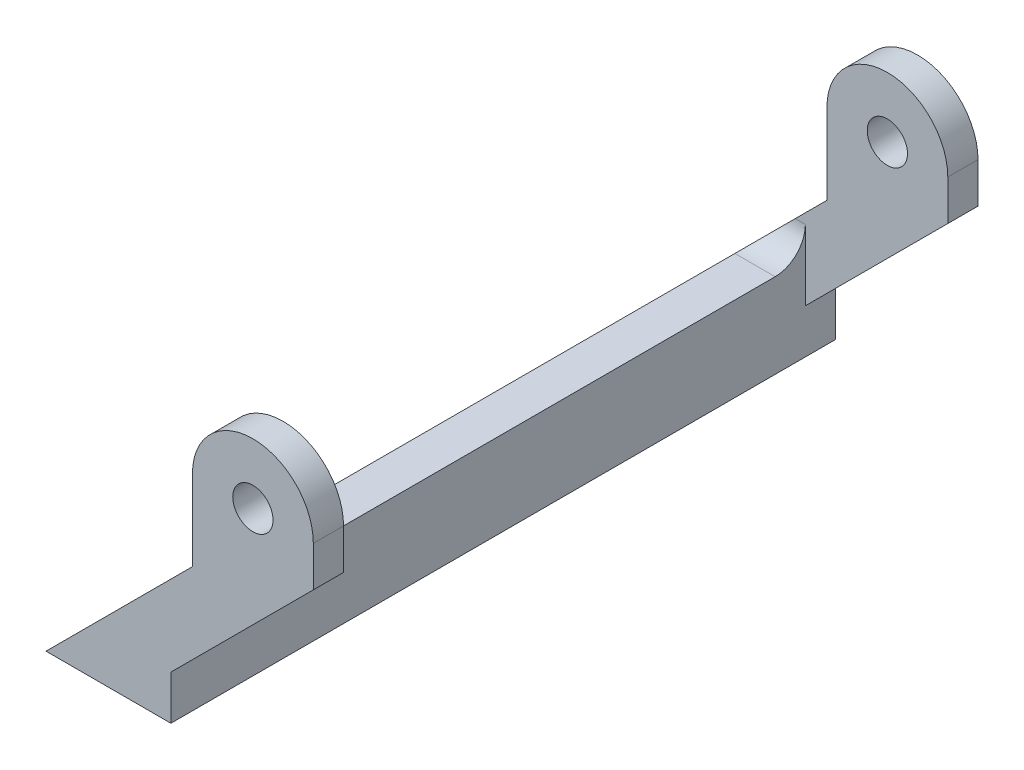
ISO-10303-21;
HEADER;
FILE_DESCRIPTION(('STEP AP214'),'2;1');
FILE_NAME('part.step','',(''),(''),'','','');
FILE_SCHEMA(('AUTOMOTIVE_DESIGN { 1 0 10303 214 1 1 1 1 }'));
ENDSEC;
DATA;
#1=APPLICATION_CONTEXT('core data for automotive mechanical design processes');
#2=APPLICATION_PROTOCOL_DEFINITION('international standard','automotive_design',2000,#1);
#3=PRODUCT_CONTEXT('',#1,'mechanical');
#4=PRODUCT('Part','Part','',(#3));
#5=PRODUCT_RELATED_PRODUCT_CATEGORY('part','',(#4));
#6=PRODUCT_DEFINITION_FORMATION('','',#4);
#7=PRODUCT_DEFINITION_CONTEXT('part definition',#1,'design');
#8=PRODUCT_DEFINITION('design','',#6,#7);
#9=PRODUCT_DEFINITION_SHAPE('','',#8);
#10=(LENGTH_UNIT() NAMED_UNIT(*) SI_UNIT(.MILLI.,.METRE.));
#11=(NAMED_UNIT(*) PLANE_ANGLE_UNIT() SI_UNIT($,.RADIAN.));
#12=(NAMED_UNIT(*) SI_UNIT($,.STERADIAN.) SOLID_ANGLE_UNIT());
#13=UNCERTAINTY_MEASURE_WITH_UNIT(LENGTH_MEASURE(1.E-05),#10,'distance_accuracy_value','');
#14=(GEOMETRIC_REPRESENTATION_CONTEXT(3) GLOBAL_UNCERTAINTY_ASSIGNED_CONTEXT((#13)) GLOBAL_UNIT_ASSIGNED_CONTEXT((#10,
#11,#12)) REPRESENTATION_CONTEXT('',''));
#15=CARTESIAN_POINT('',(0.,0.,0.));
#16=DIRECTION('',(0.,0.,1.));
#17=DIRECTION('',(1.,0.,0.));
#18=AXIS2_PLACEMENT_3D('',#15,#16,#17);
#19=CARTESIAN_POINT('',(3.33673374268399,8.94083562968921,3.));
#20=DIRECTION('',(0.,0.,-1.));
#21=DIRECTION('',(-1.,0.,0.));
#22=AXIS2_PLACEMENT_3D('',#19,#20,#21);
#23=CYLINDRICAL_SURFACE('',#22,6.00000000000001);
#24=CARTESIAN_POINT('',(3.33673374268399,8.94083562968921,0.));
#25=DIRECTION('',(0.,0.,1.));
#26=DIRECTION('',(-1.,0.,0.));
#27=AXIS2_PLACEMENT_3D('',#24,#25,#26);
#28=CIRCLE('',#27,6.00000000000001);
#29=CARTESIAN_POINT('',(9.33673374268399,8.94083562968921,0.));
#30=VERTEX_POINT('',#29);
#31=CARTESIAN_POINT('',(-2.66326625731602,8.94083562968921,0.));
#32=VERTEX_POINT('',#31);
#33=EDGE_CURVE('E218',#30,#32,#28,.T.);
#34=ORIENTED_EDGE('',*,*,#33,.T.);
#35=DIRECTION('',(0.,0.,-1.));
#36=VECTOR('',#35,1.);
#37=CARTESIAN_POINT('',(-2.66326625731602,8.94083562968921,3.));
#38=LINE('',#37,#36);
#39=CARTESIAN_POINT('',(-2.66326625731602,8.94083562968921,3.));
#40=VERTEX_POINT('',#39);
#41=EDGE_CURVE('E254',#40,#32,#38,.T.);
#42=ORIENTED_EDGE('',*,*,#41,.F.);
#43=CARTESIAN_POINT('',(3.33673374268399,8.94083562968921,3.));
#44=DIRECTION('',(0.,0.,1.));
#45=DIRECTION('',(-1.,0.,0.));
#46=AXIS2_PLACEMENT_3D('',#43,#44,#45);
#47=CIRCLE('',#46,6.00000000000001);
#48=CARTESIAN_POINT('',(9.33673374268399,8.94083562968921,3.));
#49=VERTEX_POINT('',#48);
#50=EDGE_CURVE('E219',#49,#40,#47,.T.);
#51=ORIENTED_EDGE('',*,*,#50,.F.);
#52=DIRECTION('',(0.,0.,-1.));
#53=VECTOR('',#52,1.);
#54=CARTESIAN_POINT('',(9.33673374268399,8.94083562968921,3.));
#55=LINE('',#54,#53);
#56=EDGE_CURVE('E234',#49,#30,#55,.T.);
#57=ORIENTED_EDGE('',*,*,#56,.T.);
#58=EDGE_LOOP('',(#34,#42,#51,#57));
#59=FACE_BOUND('',#58,.T.);
#60=ADVANCED_FACE('F32',(#59),#23,.T.);
#61=CARTESIAN_POINT('',(-2.663266257316,0.940835629689225,3.));
#62=DIRECTION('',(1.,0.,0.));
#63=DIRECTION('',(0.,1.,0.));
#64=AXIS2_PLACEMENT_3D('',#61,#62,#63);
#65=PLANE('',#64);
#66=DIRECTION('',(0.,-1.,0.));
#67=VECTOR('',#66,1.);
#68=CARTESIAN_POINT('',(-2.663266257316,0.940835629689225,0.));
#69=LINE('',#68,#67);
#70=CARTESIAN_POINT('',(-2.663266257316,0.940835629689225,0.));
#71=VERTEX_POINT('',#70);
#72=EDGE_CURVE('E237',#32,#71,#69,.T.);
#73=ORIENTED_EDGE('',*,*,#72,.T.);
#74=DIRECTION('',(0.,0.,-1.));
#75=VECTOR('',#74,1.);
#76=CARTESIAN_POINT('',(-2.663266257316,0.940835629689225,3.));
#77=LINE('',#76,#75);
#78=CARTESIAN_POINT('',(-2.663266257316,0.940835629689225,3.));
#79=VERTEX_POINT('',#78);
#80=EDGE_CURVE('E251',#79,#71,#77,.T.);
#81=ORIENTED_EDGE('',*,*,#80,.F.);
#82=DIRECTION('',(0.,-1.,0.));
#83=VECTOR('',#82,1.);
#84=CARTESIAN_POINT('',(-2.663266257316,0.940835629689225,3.));
#85=LINE('',#84,#83);
#86=EDGE_CURVE('E222',#40,#79,#85,.T.);
#87=ORIENTED_EDGE('',*,*,#86,.F.);
#88=ORIENTED_EDGE('',*,*,#41,.T.);
#89=EDGE_LOOP('',(#73,#81,#87,#88));
#90=FACE_BOUND('',#89,.T.);
#91=ADVANCED_FACE('F322',(#90),#65,.F.);
#92=CARTESIAN_POINT('',(-8.80540188104695,-5.2012999940417,3.));
#93=DIRECTION('',(0.707106781186546,-0.707106781186549,0.));
#94=DIRECTION('',(0.707106781186549,0.707106781186546,0.));
#95=AXIS2_PLACEMENT_3D('',#92,#93,#94);
#96=PLANE('',#95);
#97=DIRECTION('',(-0.707106781186549,-0.707106781186546,0.));
#98=VECTOR('',#97,1.);
#99=CARTESIAN_POINT('',(-8.80540188104695,-5.2012999940417,0.));
#100=LINE('',#99,#98);
#101=CARTESIAN_POINT('',(-17.205401881047,-13.6012999940417,0.));
#102=VERTEX_POINT('',#101);
#103=EDGE_CURVE('E239',#71,#102,#100,.T.);
#104=ORIENTED_EDGE('',*,*,#103,.T.);
#105=DIRECTION('',(0.,0.,-1.));
#106=VECTOR('',#105,1.);
#107=CARTESIAN_POINT('',(-17.205401881047,-13.6012999940417,66.));
#108=LINE('',#107,#106);
#109=CARTESIAN_POINT('',(-17.205401881047,-13.6012999940417,66.));
#110=VERTEX_POINT('',#109);
#111=EDGE_CURVE('E215',#110,#102,#108,.T.);
#112=ORIENTED_EDGE('',*,*,#111,.F.);
#113=DIRECTION('',(-0.707106781186551,-0.707106781186544,0.));
#114=VECTOR('',#113,1.);
#115=CARTESIAN_POINT('',(-17.205401881047,-13.6012999940417,66.));
#116=LINE('',#115,#114);
#117=CARTESIAN_POINT('',(-2.663266257316,0.940835629689225,66.));
#118=VERTEX_POINT('',#117);
#119=EDGE_CURVE('E195',#118,#110,#116,.T.);
#120=ORIENTED_EDGE('',*,*,#119,.F.);
#121=DIRECTION('',(0.,0.,1.));
#122=VECTOR('',#121,1.);
#123=CARTESIAN_POINT('',(-2.663266257316,0.940835629689225,63.));
#124=LINE('',#123,#122);
#125=CARTESIAN_POINT('',(-2.663266257316,0.940835629689225,63.));
#126=VERTEX_POINT('',#125);
#127=EDGE_CURVE('E186',#126,#118,#124,.T.);
#128=ORIENTED_EDGE('',*,*,#127,.F.);
#129=DIRECTION('',(-0.707106781186549,-0.707106781186546,0.));
#130=VECTOR('',#129,1.);
#131=CARTESIAN_POINT('',(-8.80540188104695,-5.2012999940417,63.));
#132=LINE('',#131,#130);
#133=CARTESIAN_POINT('',(-5.80540188104694,-2.2012999940417,63.));
#134=VERTEX_POINT('',#133);
#135=EDGE_CURVE('E164',#126,#134,#132,.T.);
#136=ORIENTED_EDGE('',*,*,#135,.T.);
#137=CARTESIAN_POINT('',(-5.80540188104694,-2.2012999940417,60.));
#138=DIRECTION('',(0.707106781186546,-0.707106781186549,0.));
#139=DIRECTION('',(0.707106781186549,0.707106781186546,0.));
#140=AXIS2_PLACEMENT_3D('',#137,#138,#139);
#141=ELLIPSE('',#140,4.24264068711929,3.);
#142=CARTESIAN_POINT('',(-8.80540188104695,-5.2012999940417,60.));
#143=VERTEX_POINT('',#142);
#144=EDGE_CURVE('E11',#134,#143,#141,.T.);
#145=ORIENTED_EDGE('',*,*,#144,.T.);
#146=DIRECTION('',(0.,0.,-1.));
#147=VECTOR('',#146,1.);
#148=CARTESIAN_POINT('',(-8.80540188104695,-5.2012999940417,66.));
#149=LINE('',#148,#147);
#150=CARTESIAN_POINT('',(-8.80540188104695,-5.2012999940417,6.));
#151=VERTEX_POINT('',#150);
#152=EDGE_CURVE('E203',#143,#151,#149,.T.);
#153=ORIENTED_EDGE('',*,*,#152,.T.);
#154=CARTESIAN_POINT('',(-5.80540188104694,-2.2012999940417,6.));
#155=DIRECTION('',(0.707106781186546,-0.707106781186549,0.));
#156=DIRECTION('',(-0.707106781186549,-0.707106781186546,0.));
#157=AXIS2_PLACEMENT_3D('',#154,#155,#156);
#158=ELLIPSE('',#157,4.24264068711929,3.);
#159=CARTESIAN_POINT('',(-5.80540188104694,-2.2012999940417,3.));
#160=VERTEX_POINT('',#159);
#161=EDGE_CURVE('E268',#151,#160,#158,.T.);
#162=ORIENTED_EDGE('',*,*,#161,.T.);
#163=DIRECTION('',(-0.707106781186549,-0.707106781186546,0.));
#164=VECTOR('',#163,1.);
#165=CARTESIAN_POINT('',(-8.80540188104695,-5.2012999940417,3.));
#166=LINE('',#165,#164);
#167=EDGE_CURVE('E225',#79,#160,#166,.T.);
#168=ORIENTED_EDGE('',*,*,#167,.F.);
#169=ORIENTED_EDGE('',*,*,#80,.T.);
#170=EDGE_LOOP('',(#104,#112,#120,#128,#136,#145,#153,#162,#168,#169));
#171=FACE_BOUND('',#170,.T.);
#172=ADVANCED_FACE('F272',(#171),#96,.F.);
#173=CARTESIAN_POINT('',(9.336733742684,4.94083562968922,3.));
#174=DIRECTION('',(-0.707106781186546,0.707106781186549,0.));
#175=DIRECTION('',(-0.707106781186549,-0.707106781186546,0.));
#176=AXIS2_PLACEMENT_3D('',#173,#174,#175);
#177=PLANE('',#176);
#178=DIRECTION('',(0.707106781186549,0.707106781186546,0.));
#179=VECTOR('',#178,1.);
#180=CARTESIAN_POINT('',(9.336733742684,4.94083562968922,0.));
#181=LINE('',#180,#179);
#182=CARTESIAN_POINT('',(-4.80540188104697,-9.2012999940417,0.));
#183=VERTEX_POINT('',#182);
#184=CARTESIAN_POINT('',(9.336733742684,4.94083562968922,0.));
#185=VERTEX_POINT('',#184);
#186=EDGE_CURVE('E241',#183,#185,#181,.T.);
#187=ORIENTED_EDGE('',*,*,#186,.T.);
#188=DIRECTION('',(0.,0.,-1.));
#189=VECTOR('',#188,1.);
#190=CARTESIAN_POINT('',(9.336733742684,4.94083562968922,3.));
#191=LINE('',#190,#189);
#192=CARTESIAN_POINT('',(9.336733742684,4.94083562968922,3.));
#193=VERTEX_POINT('',#192);
#194=EDGE_CURVE('E246',#193,#185,#191,.T.);
#195=ORIENTED_EDGE('',*,*,#194,.F.);
#196=DIRECTION('',(0.707106781186549,0.707106781186546,0.));
#197=VECTOR('',#196,1.);
#198=CARTESIAN_POINT('',(9.336733742684,4.94083562968922,3.));
#199=LINE('',#198,#197);
#200=CARTESIAN_POINT('',(-4.80540188104697,-9.2012999940417,3.));
#201=VERTEX_POINT('',#200);
#202=EDGE_CURVE('E230',#201,#193,#199,.T.);
#203=ORIENTED_EDGE('',*,*,#202,.F.);
#204=DIRECTION('',(0.,0.,-1.));
#205=VECTOR('',#204,1.);
#206=CARTESIAN_POINT('',(-4.80540188104697,-9.2012999940417,3.));
#207=LINE('',#206,#205);
#208=EDGE_CURVE('E249',#201,#183,#207,.T.);
#209=ORIENTED_EDGE('',*,*,#208,.T.);
#210=EDGE_LOOP('',(#187,#195,#203,#209));
#211=FACE_BOUND('',#210,.T.);
#212=ADVANCED_FACE('F312',(#211),#177,.F.);
#213=CARTESIAN_POINT('',(9.336733742684,4.94083562968922,3.));
#214=DIRECTION('',(-1.,0.,0.));
#215=DIRECTION('',(0.,-1.,0.));
#216=AXIS2_PLACEMENT_3D('',#213,#214,#215);
#217=PLANE('',#216);
#218=DIRECTION('',(0.,1.,0.));
#219=VECTOR('',#218,1.);
#220=CARTESIAN_POINT('',(9.336733742684,4.94083562968922,0.));
#221=LINE('',#220,#219);
#222=EDGE_CURVE('E223',#185,#30,#221,.T.);
#223=ORIENTED_EDGE('',*,*,#222,.T.);
#224=ORIENTED_EDGE('',*,*,#56,.F.);
#225=DIRECTION('',(0.,1.,0.));
#226=VECTOR('',#225,1.);
#227=CARTESIAN_POINT('',(9.336733742684,4.94083562968922,3.));
#228=LINE('',#227,#226);
#229=EDGE_CURVE('E232',#193,#49,#228,.T.);
#230=ORIENTED_EDGE('',*,*,#229,.F.);
#231=ORIENTED_EDGE('',*,*,#194,.T.);
#232=EDGE_LOOP('',(#223,#224,#230,#231));
#233=FACE_BOUND('',#232,.T.);
#234=ADVANCED_FACE('F316',(#233),#217,.F.);
#235=CARTESIAN_POINT('',(3.33673374268399,8.94083562968921,3.));
#236=DIRECTION('',(0.,0.,-1.));
#237=DIRECTION('',(-1.,0.,0.));
#238=AXIS2_PLACEMENT_3D('',#235,#236,#237);
#239=PLANE('',#238);
#240=CARTESIAN_POINT('',(3.33673374268399,8.94083562968921,3.));
#241=DIRECTION('',(0.,0.,1.));
#242=DIRECTION('',(1.,0.,0.));
#243=AXIS2_PLACEMENT_3D('',#240,#241,#242);
#244=CIRCLE('',#243,2.);
#245=CARTESIAN_POINT('',(5.33673374268399,8.94083562968921,3.));
#246=VERTEX_POINT('',#245);
#247=EDGE_CURVE('E508',#246,#246,#244,.T.);
#248=ORIENTED_EDGE('',*,*,#247,.F.);
#249=EDGE_LOOP('',(#248));
#250=FACE_BOUND('',#249,.T.);
#251=ORIENTED_EDGE('',*,*,#167,.T.);
#252=DIRECTION('',(1.,0.,0.));
#253=VECTOR('',#252,1.);
#254=CARTESIAN_POINT('',(-4.80540188104697,-2.2012999940417,3.));
#255=LINE('',#254,#253);
#256=CARTESIAN_POINT('',(-4.80540188104697,-2.2012999940417,3.));
#257=VERTEX_POINT('',#256);
#258=EDGE_CURVE('E257',#160,#257,#255,.T.);
#259=ORIENTED_EDGE('',*,*,#258,.T.);
#260=DIRECTION('',(0.,-1.,0.));
#261=VECTOR('',#260,1.);
#262=CARTESIAN_POINT('',(-4.80540188104697,-5.2012999940417,3.));
#263=LINE('',#262,#261);
#264=EDGE_CURVE('E228',#257,#201,#263,.T.);
#265=ORIENTED_EDGE('',*,*,#264,.T.);
#266=ORIENTED_EDGE('',*,*,#202,.T.);
#267=ORIENTED_EDGE('',*,*,#229,.T.);
#268=ORIENTED_EDGE('',*,*,#50,.T.);
#269=ORIENTED_EDGE('',*,*,#86,.T.);
#270=EDGE_LOOP('',(#251,#259,#265,#266,#267,#268,#269));
#271=FACE_BOUND('',#270,.T.);
#272=ADVANCED_FACE('F278',(#250,#271),#239,.F.);
#273=CARTESIAN_POINT('',(3.33673374268399,8.94083562968921,0.));
#274=DIRECTION('',(0.,0.,-1.));
#275=DIRECTION('',(-1.,0.,0.));
#276=AXIS2_PLACEMENT_3D('',#273,#274,#275);
#277=PLANE('',#276);
#278=CARTESIAN_POINT('',(3.33673374268399,8.94083562968921,0.));
#279=DIRECTION('',(0.,0.,-1.));
#280=DIRECTION('',(-1.,0.,0.));
#281=AXIS2_PLACEMENT_3D('',#278,#279,#280);
#282=CIRCLE('',#281,2.);
#283=CARTESIAN_POINT('',(1.33673374268399,8.94083562968921,0.));
#284=VERTEX_POINT('',#283);
#285=EDGE_CURVE('E178',#284,#284,#282,.F.);
#286=ORIENTED_EDGE('',*,*,#285,.T.);
#287=EDGE_LOOP('',(#286));
#288=FACE_BOUND('',#287,.T.);
#289=ORIENTED_EDGE('',*,*,#186,.F.);
#290=DIRECTION('',(0.,1.,0.));
#291=VECTOR('',#290,1.);
#292=CARTESIAN_POINT('',(-4.80540188104697,-5.2012999940417,0.));
#293=LINE('',#292,#291);
#294=CARTESIAN_POINT('',(-4.80540188104697,-13.6012999940417,0.));
#295=VERTEX_POINT('',#294);
#296=EDGE_CURVE('E199',#295,#183,#293,.T.);
#297=ORIENTED_EDGE('',*,*,#296,.F.);
#298=DIRECTION('',(1.,0.,0.));
#299=VECTOR('',#298,1.);
#300=CARTESIAN_POINT('',(-4.80540188104697,-13.6012999940417,0.));
#301=LINE('',#300,#299);
#302=EDGE_CURVE('E189',#102,#295,#301,.T.);
#303=ORIENTED_EDGE('',*,*,#302,.F.);
#304=ORIENTED_EDGE('',*,*,#103,.F.);
#305=ORIENTED_EDGE('',*,*,#72,.F.);
#306=ORIENTED_EDGE('',*,*,#33,.F.);
#307=ORIENTED_EDGE('',*,*,#222,.F.);
#308=EDGE_LOOP('',(#289,#297,#303,#304,#305,#306,#307));
#309=FACE_BOUND('',#308,.T.);
#310=ADVANCED_FACE('F306',(#288,#309),#277,.T.);
#311=CARTESIAN_POINT('',(-4.80540188104697,-5.2012999940417,66.));
#312=DIRECTION('',(-1.,0.,0.));
#313=DIRECTION('',(0.,-1.,0.));
#314=AXIS2_PLACEMENT_3D('',#311,#312,#313);
#315=PLANE('',#314);
#316=DIRECTION('',(0.,-1.,0.));
#317=VECTOR('',#316,1.);
#318=CARTESIAN_POINT('',(-4.80540188104697,-5.2012999940417,63.));
#319=LINE('',#318,#317);
#320=CARTESIAN_POINT('',(-4.80540188104697,-2.2012999940417,63.));
#321=VERTEX_POINT('',#320);
#322=CARTESIAN_POINT('',(-4.80540188104697,-9.2012999940417,63.));
#323=VERTEX_POINT('',#322);
#324=EDGE_CURVE('E47',#321,#323,#319,.T.);
#325=ORIENTED_EDGE('',*,*,#324,.T.);
#326=DIRECTION('',(0.,0.,1.));
#327=VECTOR('',#326,1.);
#328=CARTESIAN_POINT('',(-4.80540188104697,-9.2012999940417,63.));
#329=LINE('',#328,#327);
#330=CARTESIAN_POINT('',(-4.80540188104697,-9.2012999940417,66.));
#331=VERTEX_POINT('',#330);
#332=EDGE_CURVE('E145',#323,#331,#329,.T.);
#333=ORIENTED_EDGE('',*,*,#332,.T.);
#334=DIRECTION('',(0.,1.,0.));
#335=VECTOR('',#334,1.);
#336=CARTESIAN_POINT('',(-4.80540188104697,-5.2012999940417,66.));
#337=LINE('',#336,#335);
#338=CARTESIAN_POINT('',(-4.80540188104697,-13.6012999940417,66.));
#339=VERTEX_POINT('',#338);
#340=EDGE_CURVE('E201',#339,#331,#337,.T.);
#341=ORIENTED_EDGE('',*,*,#340,.F.);
#342=DIRECTION('',(0.,0.,-1.));
#343=VECTOR('',#342,1.);
#344=CARTESIAN_POINT('',(-4.80540188104697,-13.6012999940417,66.));
#345=LINE('',#344,#343);
#346=EDGE_CURVE('E212',#339,#295,#345,.T.);
#347=ORIENTED_EDGE('',*,*,#346,.T.);
#348=ORIENTED_EDGE('',*,*,#296,.T.);
#349=ORIENTED_EDGE('',*,*,#208,.F.);
#350=ORIENTED_EDGE('',*,*,#264,.F.);
#351=CARTESIAN_POINT('',(-4.80540188104697,-2.2012999940417,6.));
#352=DIRECTION('',(-1.,0.,0.));
#353=DIRECTION('',(0.,-1.,0.));
#354=AXIS2_PLACEMENT_3D('',#351,#352,#353);
#355=CIRCLE('',#354,3.);
#356=CARTESIAN_POINT('',(-4.80540188104697,-5.2012999940417,6.));
#357=VERTEX_POINT('',#356);
#358=EDGE_CURVE('E266',#257,#357,#355,.T.);
#359=ORIENTED_EDGE('',*,*,#358,.T.);
#360=DIRECTION('',(0.,0.,-1.));
#361=VECTOR('',#360,1.);
#362=CARTESIAN_POINT('',(-4.80540188104697,-5.2012999940417,66.));
#363=LINE('',#362,#361);
#364=CARTESIAN_POINT('',(-4.80540188104697,-5.2012999940417,60.));
#365=VERTEX_POINT('',#364);
#366=EDGE_CURVE('E209',#365,#357,#363,.T.);
#367=ORIENTED_EDGE('',*,*,#366,.F.);
#368=CARTESIAN_POINT('',(-4.80540188104697,-2.2012999940417,60.));
#369=DIRECTION('',(-1.,0.,0.));
#370=DIRECTION('',(0.,-1.,0.));
#371=AXIS2_PLACEMENT_3D('',#368,#369,#370);
#372=CIRCLE('',#371,3.);
#373=EDGE_CURVE('E40',#365,#321,#372,.T.);
#374=ORIENTED_EDGE('',*,*,#373,.T.);
#375=EDGE_LOOP('',(#325,#333,#341,#347,#348,#349,#350,#359,#367,#374));
#376=FACE_BOUND('',#375,.T.);
#377=ADVANCED_FACE('F162',(#376),#315,.F.);
#378=CARTESIAN_POINT('',(-8.80540188104695,-5.2012999940417,66.));
#379=DIRECTION('',(0.,-1.,0.));
#380=DIRECTION('',(1.,0.,0.));
#381=AXIS2_PLACEMENT_3D('',#378,#379,#380);
#382=PLANE('',#381);
#383=ORIENTED_EDGE('',*,*,#366,.T.);
#384=DIRECTION('',(1.,0.,0.));
#385=VECTOR('',#384,1.);
#386=CARTESIAN_POINT('',(-8.80540188104695,-5.2012999940417,6.));
#387=LINE('',#386,#385);
#388=EDGE_CURVE('E263',#357,#151,#387,.F.);
#389=ORIENTED_EDGE('',*,*,#388,.T.);
#390=ORIENTED_EDGE('',*,*,#152,.F.);
#391=DIRECTION('',(1.,0.,0.));
#392=VECTOR('',#391,1.);
#393=CARTESIAN_POINT('',(-8.80540188104695,-5.2012999940417,60.));
#394=LINE('',#393,#392);
#395=EDGE_CURVE('E260',#143,#365,#394,.T.);
#396=ORIENTED_EDGE('',*,*,#395,.T.);
#397=EDGE_LOOP('',(#383,#389,#390,#396));
#398=FACE_BOUND('',#397,.T.);
#399=ADVANCED_FACE('F284',(#398),#382,.F.);
#400=CARTESIAN_POINT('',(-4.80540188104697,-13.6012999940417,66.));
#401=DIRECTION('',(0.,1.,0.));
#402=DIRECTION('',(-1.,0.,0.));
#403=AXIS2_PLACEMENT_3D('',#400,#401,#402);
#404=PLANE('',#403);
#405=ORIENTED_EDGE('',*,*,#302,.T.);
#406=ORIENTED_EDGE('',*,*,#346,.F.);
#407=DIRECTION('',(1.,0.,0.));
#408=VECTOR('',#407,1.);
#409=CARTESIAN_POINT('',(-4.80540188104697,-13.6012999940417,66.));
#410=LINE('',#409,#408);
#411=EDGE_CURVE('E198',#110,#339,#410,.T.);
#412=ORIENTED_EDGE('',*,*,#411,.F.);
#413=ORIENTED_EDGE('',*,*,#111,.T.);
#414=EDGE_LOOP('',(#405,#406,#412,#413));
#415=FACE_BOUND('',#414,.T.);
#416=ADVANCED_FACE('F324',(#415),#404,.F.);
#417=CARTESIAN_POINT('',(-4.80540188104697,-1.20129999404176,66.));
#418=DIRECTION('',(0.,0.,-1.));
#419=DIRECTION('',(-1.,0.,0.));
#420=AXIS2_PLACEMENT_3D('',#417,#418,#419);
#421=PLANE('',#420);
#422=CARTESIAN_POINT('',(3.33673374268399,8.94083562968921,66.));
#423=DIRECTION('',(0.,0.,-1.));
#424=DIRECTION('',(-1.,0.,0.));
#425=AXIS2_PLACEMENT_3D('',#422,#423,#424);
#426=CIRCLE('',#425,2.);
#427=CARTESIAN_POINT('',(1.33673374268399,8.94083562968921,66.));
#428=VERTEX_POINT('',#427);
#429=EDGE_CURVE('E510',#428,#428,#426,.F.);
#430=ORIENTED_EDGE('',*,*,#429,.F.);
#431=EDGE_LOOP('',(#430));
#432=FACE_BOUND('',#431,.T.);
#433=ORIENTED_EDGE('',*,*,#340,.T.);
#434=DIRECTION('',(0.707106781186549,0.707106781186546,0.));
#435=VECTOR('',#434,1.);
#436=CARTESIAN_POINT('',(-4.80540188104697,-9.2012999940417,66.));
#437=LINE('',#436,#435);
#438=CARTESIAN_POINT('',(9.336733742684,4.94083562968922,66.));
#439=VERTEX_POINT('',#438);
#440=EDGE_CURVE('E149',#331,#439,#437,.T.);
#441=ORIENTED_EDGE('',*,*,#440,.T.);
#442=DIRECTION('',(0.,1.,0.));
#443=VECTOR('',#442,1.);
#444=CARTESIAN_POINT('',(9.336733742684,4.94083562968922,66.));
#445=LINE('',#444,#443);
#446=CARTESIAN_POINT('',(9.33673374268399,8.94083562968921,66.));
#447=VERTEX_POINT('',#446);
#448=EDGE_CURVE('E177',#439,#447,#445,.T.);
#449=ORIENTED_EDGE('',*,*,#448,.T.);
#450=CARTESIAN_POINT('',(3.33673374268399,8.94083562968921,66.));
#451=DIRECTION('',(0.,0.,1.));
#452=DIRECTION('',(-1.,0.,0.));
#453=AXIS2_PLACEMENT_3D('',#450,#451,#452);
#454=CIRCLE('',#453,6.00000000000001);
#455=CARTESIAN_POINT('',(-2.66326625731602,8.94083562968921,66.));
#456=VERTEX_POINT('',#455);
#457=EDGE_CURVE('E181',#447,#456,#454,.T.);
#458=ORIENTED_EDGE('',*,*,#457,.T.);
#459=DIRECTION('',(0.,-1.,0.));
#460=VECTOR('',#459,1.);
#461=CARTESIAN_POINT('',(-2.663266257316,0.940835629689225,66.));
#462=LINE('',#461,#460);
#463=EDGE_CURVE('E166',#456,#118,#462,.T.);
#464=ORIENTED_EDGE('',*,*,#463,.T.);
#465=ORIENTED_EDGE('',*,*,#119,.T.);
#466=ORIENTED_EDGE('',*,*,#411,.T.);
#467=EDGE_LOOP('',(#433,#441,#449,#458,#464,#465,#466));
#468=FACE_BOUND('',#467,.T.);
#469=ADVANCED_FACE('F299',(#432,#468),#421,.F.);
#470=CARTESIAN_POINT('',(-2.663266257316,0.940835629689225,63.));
#471=DIRECTION('',(-1.,0.,0.));
#472=DIRECTION('',(0.,-1.,0.));
#473=AXIS2_PLACEMENT_3D('',#470,#471,#472);
#474=PLANE('',#473);
#475=ORIENTED_EDGE('',*,*,#463,.F.);
#476=DIRECTION('',(0.,0.,1.));
#477=VECTOR('',#476,1.);
#478=CARTESIAN_POINT('',(-2.66326625731602,8.94083562968921,63.));
#479=LINE('',#478,#477);
#480=CARTESIAN_POINT('',(-2.66326625731602,8.94083562968921,63.));
#481=VERTEX_POINT('',#480);
#482=EDGE_CURVE('E190',#481,#456,#479,.T.);
#483=ORIENTED_EDGE('',*,*,#482,.F.);
#484=DIRECTION('',(0.,-1.,0.));
#485=VECTOR('',#484,1.);
#486=CARTESIAN_POINT('',(-2.663266257316,0.940835629689225,63.));
#487=LINE('',#486,#485);
#488=EDGE_CURVE('E154',#481,#126,#487,.T.);
#489=ORIENTED_EDGE('',*,*,#488,.T.);
#490=ORIENTED_EDGE('',*,*,#127,.T.);
#491=EDGE_LOOP('',(#475,#483,#489,#490));
#492=FACE_BOUND('',#491,.T.);
#493=ADVANCED_FACE('F291',(#492),#474,.T.);
#494=CARTESIAN_POINT('',(3.33673374268399,8.94083562968921,63.));
#495=DIRECTION('',(0.,0.,1.));
#496=DIRECTION('',(1.,0.,0.));
#497=AXIS2_PLACEMENT_3D('',#494,#495,#496);
#498=CYLINDRICAL_SURFACE('',#497,6.00000000000001);
#499=ORIENTED_EDGE('',*,*,#457,.F.);
#500=DIRECTION('',(0.,0.,1.));
#501=VECTOR('',#500,1.);
#502=CARTESIAN_POINT('',(9.33673374268399,8.94083562968921,63.));
#503=LINE('',#502,#501);
#504=CARTESIAN_POINT('',(9.33673374268399,8.94083562968921,63.));
#505=VERTEX_POINT('',#504);
#506=EDGE_CURVE('E192',#505,#447,#503,.T.);
#507=ORIENTED_EDGE('',*,*,#506,.F.);
#508=CARTESIAN_POINT('',(3.33673374268399,8.94083562968921,63.));
#509=DIRECTION('',(0.,0.,1.));
#510=DIRECTION('',(-1.,0.,0.));
#511=AXIS2_PLACEMENT_3D('',#508,#509,#510);
#512=CIRCLE('',#511,6.00000000000001);
#513=EDGE_CURVE('E171',#505,#481,#512,.T.);
#514=ORIENTED_EDGE('',*,*,#513,.T.);
#515=ORIENTED_EDGE('',*,*,#482,.T.);
#516=EDGE_LOOP('',(#499,#507,#514,#515));
#517=FACE_BOUND('',#516,.T.);
#518=ADVANCED_FACE('F294',(#517),#498,.T.);
#519=CARTESIAN_POINT('',(9.336733742684,4.94083562968922,63.));
#520=DIRECTION('',(1.,0.,0.));
#521=DIRECTION('',(0.,1.,0.));
#522=AXIS2_PLACEMENT_3D('',#519,#520,#521);
#523=PLANE('',#522);
#524=ORIENTED_EDGE('',*,*,#448,.F.);
#525=DIRECTION('',(0.,0.,1.));
#526=VECTOR('',#525,1.);
#527=CARTESIAN_POINT('',(9.336733742684,4.94083562968922,63.));
#528=LINE('',#527,#526);
#529=CARTESIAN_POINT('',(9.336733742684,4.94083562968922,63.));
#530=VERTEX_POINT('',#529);
#531=EDGE_CURVE('E153',#530,#439,#528,.T.);
#532=ORIENTED_EDGE('',*,*,#531,.F.);
#533=DIRECTION('',(0.,1.,0.));
#534=VECTOR('',#533,1.);
#535=CARTESIAN_POINT('',(9.336733742684,4.94083562968922,63.));
#536=LINE('',#535,#534);
#537=EDGE_CURVE('E160',#530,#505,#536,.T.);
#538=ORIENTED_EDGE('',*,*,#537,.T.);
#539=ORIENTED_EDGE('',*,*,#506,.T.);
#540=EDGE_LOOP('',(#524,#532,#538,#539));
#541=FACE_BOUND('',#540,.T.);
#542=ADVANCED_FACE('F297',(#541),#523,.T.);
#543=CARTESIAN_POINT('',(-4.80540188104697,-9.2012999940417,63.));
#544=DIRECTION('',(0.707106781186546,-0.707106781186549,0.));
#545=DIRECTION('',(0.707106781186549,0.707106781186546,0.));
#546=AXIS2_PLACEMENT_3D('',#543,#544,#545);
#547=PLANE('',#546);
#548=ORIENTED_EDGE('',*,*,#440,.F.);
#549=ORIENTED_EDGE('',*,*,#332,.F.);
#550=DIRECTION('',(0.707106781186549,0.707106781186546,0.));
#551=VECTOR('',#550,1.);
#552=CARTESIAN_POINT('',(-4.80540188104697,-9.2012999940417,63.));
#553=LINE('',#552,#551);
#554=EDGE_CURVE('E147',#323,#530,#553,.T.);
#555=ORIENTED_EDGE('',*,*,#554,.T.);
#556=ORIENTED_EDGE('',*,*,#531,.T.);
#557=EDGE_LOOP('',(#548,#549,#555,#556));
#558=FACE_BOUND('',#557,.T.);
#559=ADVANCED_FACE('F146',(#558),#547,.T.);
#560=CARTESIAN_POINT('',(3.33673374268399,8.94083562968921,63.));
#561=DIRECTION('',(0.,0.,-1.));
#562=DIRECTION('',(-1.,0.,0.));
#563=AXIS2_PLACEMENT_3D('',#560,#561,#562);
#564=PLANE('',#563);
#565=CARTESIAN_POINT('',(3.33673374268399,8.94083562968921,63.));
#566=DIRECTION('',(0.,0.,-1.));
#567=DIRECTION('',(-1.,0.,0.));
#568=AXIS2_PLACEMENT_3D('',#565,#566,#567);
#569=CIRCLE('',#568,2.);
#570=CARTESIAN_POINT('',(1.33673374268399,8.94083562968921,63.));
#571=VERTEX_POINT('',#570);
#572=EDGE_CURVE('E514',#571,#571,#569,.T.);
#573=ORIENTED_EDGE('',*,*,#572,.F.);
#574=EDGE_LOOP('',(#573));
#575=FACE_BOUND('',#574,.T.);
#576=ORIENTED_EDGE('',*,*,#324,.F.);
#577=DIRECTION('',(1.,0.,0.));
#578=VECTOR('',#577,1.);
#579=CARTESIAN_POINT('',(3.33673374268399,-2.2012999940417,63.));
#580=LINE('',#579,#578);
#581=EDGE_CURVE('E52',#321,#134,#580,.F.);
#582=ORIENTED_EDGE('',*,*,#581,.T.);
#583=ORIENTED_EDGE('',*,*,#135,.F.);
#584=ORIENTED_EDGE('',*,*,#488,.F.);
#585=ORIENTED_EDGE('',*,*,#513,.F.);
#586=ORIENTED_EDGE('',*,*,#537,.F.);
#587=ORIENTED_EDGE('',*,*,#554,.F.);
#588=EDGE_LOOP('',(#576,#582,#583,#584,#585,#586,#587));
#589=FACE_BOUND('',#588,.T.);
#590=ADVANCED_FACE('F157',(#575,#589),#564,.T.);
#591=CARTESIAN_POINT('',(3.33673374268399,8.94083562968921,-5.65685424949238));
#592=DIRECTION('',(0.,0.,1.));
#593=DIRECTION('',(1.,0.,0.));
#594=AXIS2_PLACEMENT_3D('',#591,#592,#593);
#595=CYLINDRICAL_SURFACE('',#594,2.);
#596=ORIENTED_EDGE('',*,*,#247,.T.);
#597=EDGE_LOOP('',(#596));
#598=FACE_BOUND('',#597,.T.);
#599=ORIENTED_EDGE('',*,*,#285,.F.);
#600=EDGE_LOOP('',(#599));
#601=FACE_BOUND('',#600,.T.);
#602=ADVANCED_FACE('F349',(#598,#601),#595,.F.);
#603=CARTESIAN_POINT('',(3.33673374268399,8.94083562968921,71.6568542494924));
#604=DIRECTION('',(0.,0.,-1.));
#605=DIRECTION('',(-1.,0.,0.));
#606=AXIS2_PLACEMENT_3D('',#603,#604,#605);
#607=CYLINDRICAL_SURFACE('',#606,2.);
#608=ORIENTED_EDGE('',*,*,#429,.T.);
#609=EDGE_LOOP('',(#608));
#610=FACE_BOUND('',#609,.T.);
#611=ORIENTED_EDGE('',*,*,#572,.T.);
#612=EDGE_LOOP('',(#611));
#613=FACE_BOUND('',#612,.T.);
#614=ADVANCED_FACE('F344',(#610,#613),#607,.F.);
#615=CARTESIAN_POINT('',(3.33673374268399,-2.2012999940417,6.));
#616=DIRECTION('',(-1.,0.,0.));
#617=DIRECTION('',(0.,-1.,0.));
#618=AXIS2_PLACEMENT_3D('',#615,#616,#617);
#619=CYLINDRICAL_SURFACE('',#618,3.);
#620=ORIENTED_EDGE('',*,*,#161,.F.);
#621=ORIENTED_EDGE('',*,*,#388,.F.);
#622=ORIENTED_EDGE('',*,*,#358,.F.);
#623=ORIENTED_EDGE('',*,*,#258,.F.);
#624=EDGE_LOOP('',(#620,#621,#622,#623));
#625=FACE_BOUND('',#624,.T.);
#626=ADVANCED_FACE('F281',(#625),#619,.F.);
#627=CARTESIAN_POINT('',(-8.80540188104695,-2.2012999940417,60.));
#628=DIRECTION('',(1.,0.,0.));
#629=DIRECTION('',(0.,1.,0.));
#630=AXIS2_PLACEMENT_3D('',#627,#628,#629);
#631=CYLINDRICAL_SURFACE('',#630,3.);
#632=ORIENTED_EDGE('',*,*,#144,.F.);
#633=ORIENTED_EDGE('',*,*,#581,.F.);
#634=ORIENTED_EDGE('',*,*,#373,.F.);
#635=ORIENTED_EDGE('',*,*,#395,.F.);
#636=EDGE_LOOP('',(#632,#633,#634,#635));
#637=FACE_BOUND('',#636,.T.);
#638=ADVANCED_FACE('F34',(#637),#631,.F.);
#639=CLOSED_SHELL('',(#60,#91,#172,#212,#234,#272,#310,#377,#399,#416,#469,#493,#518,#542,#559,
#590,#602,#614,#626,#638));
#640=MANIFOLD_SOLID_BREP('B2',#639);
#641=ADVANCED_BREP_SHAPE_REPRESENTATION('',(#18,#640),#14);
#642=SHAPE_DEFINITION_REPRESENTATION(#9,#641);
ENDSEC;
END-ISO-10303-21;
